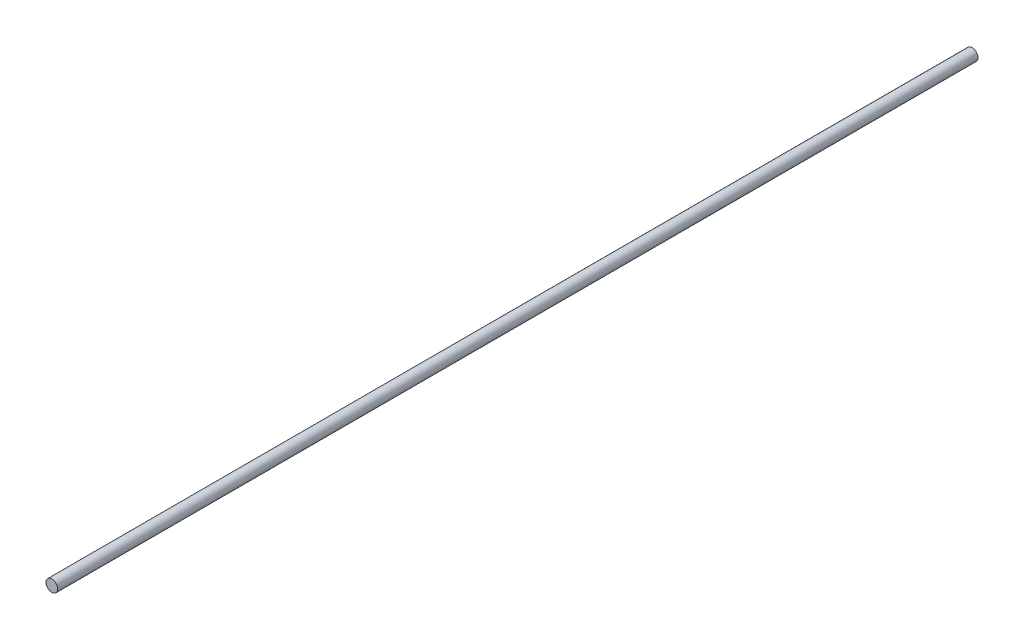
ISO-10303-21;
HEADER;
FILE_DESCRIPTION(('STEP AP214'),'2;1');
FILE_NAME('part.step','',(''),(''),'','','');
FILE_SCHEMA(('AUTOMOTIVE_DESIGN { 1 0 10303 214 1 1 1 1 }'));
ENDSEC;
DATA;
#1=APPLICATION_CONTEXT('core data for automotive mechanical design processes');
#2=APPLICATION_PROTOCOL_DEFINITION('international standard','automotive_design',2000,#1);
#3=PRODUCT_CONTEXT('',#1,'mechanical');
#4=PRODUCT('Part','Part','',(#3));
#5=PRODUCT_RELATED_PRODUCT_CATEGORY('part','',(#4));
#6=PRODUCT_DEFINITION_FORMATION('','',#4);
#7=PRODUCT_DEFINITION_CONTEXT('part definition',#1,'design');
#8=PRODUCT_DEFINITION('design','',#6,#7);
#9=PRODUCT_DEFINITION_SHAPE('','',#8);
#10=(LENGTH_UNIT() NAMED_UNIT(*) SI_UNIT(.MILLI.,.METRE.));
#11=(NAMED_UNIT(*) PLANE_ANGLE_UNIT() SI_UNIT($,.RADIAN.));
#12=(NAMED_UNIT(*) SI_UNIT($,.STERADIAN.) SOLID_ANGLE_UNIT());
#13=UNCERTAINTY_MEASURE_WITH_UNIT(LENGTH_MEASURE(1.E-05),#10,'distance_accuracy_value','');
#14=(GEOMETRIC_REPRESENTATION_CONTEXT(3) GLOBAL_UNCERTAINTY_ASSIGNED_CONTEXT((#13)) GLOBAL_UNIT_ASSIGNED_CONTEXT((#10,
#11,#12)) REPRESENTATION_CONTEXT('',''));
#15=CARTESIAN_POINT('',(0.,0.,0.));
#16=DIRECTION('',(0.,0.,1.));
#17=DIRECTION('',(1.,0.,0.));
#18=AXIS2_PLACEMENT_3D('',#15,#16,#17);
#19=CARTESIAN_POINT('',(0.,0.,500.));
#20=DIRECTION('',(0.,0.,-1.));
#21=DIRECTION('',(-1.,0.,0.));
#22=AXIS2_PLACEMENT_3D('',#19,#20,#21);
#23=CYLINDRICAL_SURFACE('',#22,3.175);
#24=CARTESIAN_POINT('',(0.,0.,500.));
#25=DIRECTION('',(0.,0.,1.));
#26=DIRECTION('',(1.,0.,0.));
#27=AXIS2_PLACEMENT_3D('',#24,#25,#26);
#28=CIRCLE('',#27,3.175);
#29=CARTESIAN_POINT('',(3.175,0.,500.));
#30=VERTEX_POINT('',#29);
#31=EDGE_CURVE('E10',#30,#30,#28,.T.);
#32=ORIENTED_EDGE('',*,*,#31,.F.);
#33=EDGE_LOOP('',(#32));
#34=FACE_BOUND('',#33,.T.);
#35=CARTESIAN_POINT('',(0.,0.,0.));
#36=DIRECTION('',(0.,0.,1.));
#37=DIRECTION('',(1.,0.,0.));
#38=AXIS2_PLACEMENT_3D('',#35,#36,#37);
#39=CIRCLE('',#38,3.175);
#40=CARTESIAN_POINT('',(3.175,0.,0.));
#41=VERTEX_POINT('',#40);
#42=EDGE_CURVE('E39',#41,#41,#39,.T.);
#43=ORIENTED_EDGE('',*,*,#42,.T.);
#44=EDGE_LOOP('',(#43));
#45=FACE_BOUND('',#44,.T.);
#46=ADVANCED_FACE('F36',(#34,#45),#23,.T.);
#47=CARTESIAN_POINT('',(0.,0.,500.));
#48=DIRECTION('',(0.,0.,1.));
#49=DIRECTION('',(1.,0.,0.));
#50=AXIS2_PLACEMENT_3D('',#47,#48,#49);
#51=PLANE('',#50);
#52=ORIENTED_EDGE('',*,*,#31,.T.);
#53=EDGE_LOOP('',(#52));
#54=FACE_BOUND('',#53,.T.);
#55=ADVANCED_FACE('F53',(#54),#51,.T.);
#56=CARTESIAN_POINT('',(0.,0.,0.));
#57=DIRECTION('',(0.,0.,1.));
#58=DIRECTION('',(1.,0.,0.));
#59=AXIS2_PLACEMENT_3D('',#56,#57,#58);
#60=PLANE('',#59);
#61=ORIENTED_EDGE('',*,*,#42,.F.);
#62=EDGE_LOOP('',(#61));
#63=FACE_BOUND('',#62,.T.);
#64=ADVANCED_FACE('F51',(#63),#60,.F.);
#65=CLOSED_SHELL('',(#46,#55,#64));
#66=MANIFOLD_SOLID_BREP('B2',#65);
#67=ADVANCED_BREP_SHAPE_REPRESENTATION('',(#18,#66),#14);
#68=SHAPE_DEFINITION_REPRESENTATION(#9,#67);
ENDSEC;
END-ISO-10303-21;
